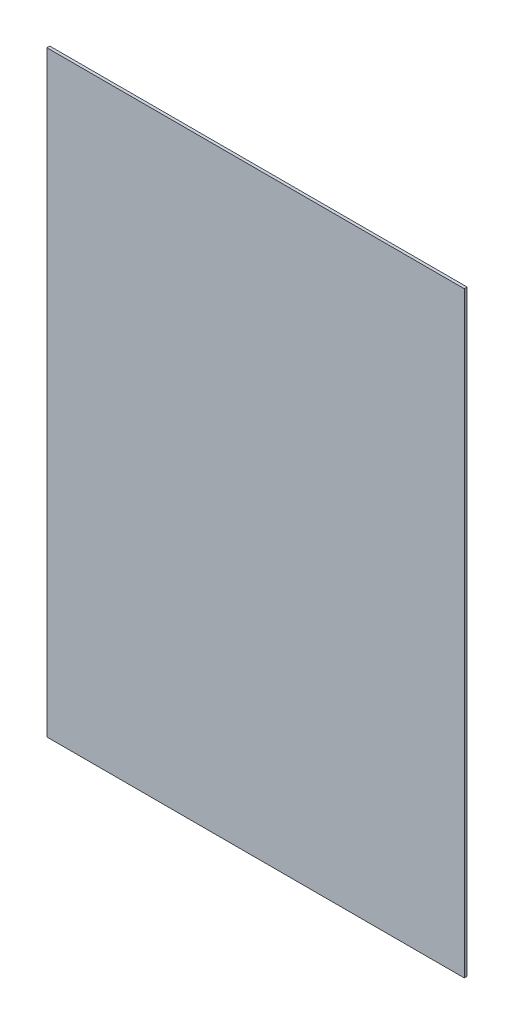
ISO-10303-21;
HEADER;
FILE_DESCRIPTION(('STEP AP214'),'2;1');
FILE_NAME('part.step','',(''),(''),'','','');
FILE_SCHEMA(('AUTOMOTIVE_DESIGN { 1 0 10303 214 1 1 1 1 }'));
ENDSEC;
DATA;
#1=APPLICATION_CONTEXT('core data for automotive mechanical design processes');
#2=APPLICATION_PROTOCOL_DEFINITION('international standard','automotive_design',2000,#1);
#3=PRODUCT_CONTEXT('',#1,'mechanical');
#4=PRODUCT('Part','Part','',(#3));
#5=PRODUCT_RELATED_PRODUCT_CATEGORY('part','',(#4));
#6=PRODUCT_DEFINITION_FORMATION('','',#4);
#7=PRODUCT_DEFINITION_CONTEXT('part definition',#1,'design');
#8=PRODUCT_DEFINITION('design','',#6,#7);
#9=PRODUCT_DEFINITION_SHAPE('','',#8);
#10=(LENGTH_UNIT() NAMED_UNIT(*) SI_UNIT(.MILLI.,.METRE.));
#11=(NAMED_UNIT(*) PLANE_ANGLE_UNIT() SI_UNIT($,.RADIAN.));
#12=(NAMED_UNIT(*) SI_UNIT($,.STERADIAN.) SOLID_ANGLE_UNIT());
#13=UNCERTAINTY_MEASURE_WITH_UNIT(LENGTH_MEASURE(1.E-05),#10,'distance_accuracy_value','');
#14=(GEOMETRIC_REPRESENTATION_CONTEXT(3) GLOBAL_UNCERTAINTY_ASSIGNED_CONTEXT((#13)) GLOBAL_UNIT_ASSIGNED_CONTEXT((#10,
#11,#12)) REPRESENTATION_CONTEXT('',''));
#15=CARTESIAN_POINT('',(0.,0.,0.));
#16=DIRECTION('',(0.,0.,1.));
#17=DIRECTION('',(1.,0.,0.));
#18=AXIS2_PLACEMENT_3D('',#15,#16,#17);
#19=CARTESIAN_POINT('',(144.05,205.95,2.));
#20=DIRECTION('',(-1.,0.,0.));
#21=DIRECTION('',(0.,-1.,0.));
#22=AXIS2_PLACEMENT_3D('',#19,#20,#21);
#23=PLANE('',#22);
#24=DIRECTION('',(0.,1.,0.));
#25=VECTOR('',#24,1.);
#26=CARTESIAN_POINT('',(144.05,205.95,0.));
#27=LINE('',#26,#25);
#28=CARTESIAN_POINT('',(144.05,-205.95,0.));
#29=VERTEX_POINT('',#28);
#30=CARTESIAN_POINT('',(144.05,205.95,0.));
#31=VERTEX_POINT('',#30);
#32=EDGE_CURVE('E96',#29,#31,#27,.T.);
#33=ORIENTED_EDGE('',*,*,#32,.T.);
#34=DIRECTION('',(0.,0.,-1.));
#35=VECTOR('',#34,1.);
#36=CARTESIAN_POINT('',(144.05,205.95,2.));
#37=LINE('',#36,#35);
#38=CARTESIAN_POINT('',(144.05,205.95,2.));
#39=VERTEX_POINT('',#38);
#40=EDGE_CURVE('E11',#39,#31,#37,.T.);
#41=ORIENTED_EDGE('',*,*,#40,.F.);
#42=DIRECTION('',(0.,1.,0.));
#43=VECTOR('',#42,1.);
#44=CARTESIAN_POINT('',(144.05,205.95,2.));
#45=LINE('',#44,#43);
#46=CARTESIAN_POINT('',(144.05,-205.95,2.));
#47=VERTEX_POINT('',#46);
#48=EDGE_CURVE('E84',#47,#39,#45,.T.);
#49=ORIENTED_EDGE('',*,*,#48,.F.);
#50=DIRECTION('',(0.,0.,-1.));
#51=VECTOR('',#50,1.);
#52=CARTESIAN_POINT('',(144.05,-205.95,2.));
#53=LINE('',#52,#51);
#54=EDGE_CURVE('E92',#47,#29,#53,.T.);
#55=ORIENTED_EDGE('',*,*,#54,.T.);
#56=EDGE_LOOP('',(#33,#41,#49,#55));
#57=FACE_BOUND('',#56,.T.);
#58=ADVANCED_FACE('F33',(#57),#23,.F.);
#59=CARTESIAN_POINT('',(-144.05,205.95,2.));
#60=DIRECTION('',(0.,-1.,0.));
#61=DIRECTION('',(0.,0.,-1.));
#62=AXIS2_PLACEMENT_3D('',#59,#60,#61);
#63=PLANE('',#62);
#64=DIRECTION('',(-1.,0.,0.));
#65=VECTOR('',#64,1.);
#66=CARTESIAN_POINT('',(-144.05,205.95,0.));
#67=LINE('',#66,#65);
#68=CARTESIAN_POINT('',(-144.05,205.95,0.));
#69=VERTEX_POINT('',#68);
#70=EDGE_CURVE('E88',#31,#69,#67,.T.);
#71=ORIENTED_EDGE('',*,*,#70,.T.);
#72=DIRECTION('',(0.,0.,-1.));
#73=VECTOR('',#72,1.);
#74=CARTESIAN_POINT('',(-144.05,205.95,2.));
#75=LINE('',#74,#73);
#76=CARTESIAN_POINT('',(-144.05,205.95,2.));
#77=VERTEX_POINT('',#76);
#78=EDGE_CURVE('E41',#77,#69,#75,.T.);
#79=ORIENTED_EDGE('',*,*,#78,.F.);
#80=DIRECTION('',(-1.,0.,0.));
#81=VECTOR('',#80,1.);
#82=CARTESIAN_POINT('',(-144.05,205.95,2.));
#83=LINE('',#82,#81);
#84=EDGE_CURVE('E79',#39,#77,#83,.T.);
#85=ORIENTED_EDGE('',*,*,#84,.F.);
#86=ORIENTED_EDGE('',*,*,#40,.T.);
#87=EDGE_LOOP('',(#71,#79,#85,#86));
#88=FACE_BOUND('',#87,.T.);
#89=ADVANCED_FACE('F87',(#88),#63,.F.);
#90=CARTESIAN_POINT('',(-144.05,205.95,2.));
#91=DIRECTION('',(1.,0.,0.));
#92=DIRECTION('',(0.,1.,0.));
#93=AXIS2_PLACEMENT_3D('',#90,#91,#92);
#94=PLANE('',#93);
#95=DIRECTION('',(0.,-1.,0.));
#96=VECTOR('',#95,1.);
#97=CARTESIAN_POINT('',(-144.05,205.95,0.));
#98=LINE('',#97,#96);
#99=CARTESIAN_POINT('',(-144.05,-205.95,0.));
#100=VERTEX_POINT('',#99);
#101=EDGE_CURVE('E66',#69,#100,#98,.T.);
#102=ORIENTED_EDGE('',*,*,#101,.T.);
#103=DIRECTION('',(0.,0.,-1.));
#104=VECTOR('',#103,1.);
#105=CARTESIAN_POINT('',(-144.05,-205.95,2.));
#106=LINE('',#105,#104);
#107=CARTESIAN_POINT('',(-144.05,-205.95,2.));
#108=VERTEX_POINT('',#107);
#109=EDGE_CURVE('E89',#108,#100,#106,.T.);
#110=ORIENTED_EDGE('',*,*,#109,.F.);
#111=DIRECTION('',(0.,-1.,0.));
#112=VECTOR('',#111,1.);
#113=CARTESIAN_POINT('',(-144.05,205.95,2.));
#114=LINE('',#113,#112);
#115=EDGE_CURVE('E82',#77,#108,#114,.T.);
#116=ORIENTED_EDGE('',*,*,#115,.F.);
#117=ORIENTED_EDGE('',*,*,#78,.T.);
#118=EDGE_LOOP('',(#102,#110,#116,#117));
#119=FACE_BOUND('',#118,.T.);
#120=ADVANCED_FACE('F90',(#119),#94,.F.);
#121=CARTESIAN_POINT('',(-144.05,-205.95,2.));
#122=DIRECTION('',(0.,1.,0.));
#123=DIRECTION('',(0.,0.,1.));
#124=AXIS2_PLACEMENT_3D('',#121,#122,#123);
#125=PLANE('',#124);
#126=DIRECTION('',(1.,0.,0.));
#127=VECTOR('',#126,1.);
#128=CARTESIAN_POINT('',(-144.05,-205.95,0.));
#129=LINE('',#128,#127);
#130=EDGE_CURVE('E72',#100,#29,#129,.T.);
#131=ORIENTED_EDGE('',*,*,#130,.T.);
#132=ORIENTED_EDGE('',*,*,#54,.F.);
#133=DIRECTION('',(1.,0.,0.));
#134=VECTOR('',#133,1.);
#135=CARTESIAN_POINT('',(-144.05,-205.95,2.));
#136=LINE('',#135,#134);
#137=EDGE_CURVE('E49',#108,#47,#136,.T.);
#138=ORIENTED_EDGE('',*,*,#137,.F.);
#139=ORIENTED_EDGE('',*,*,#109,.T.);
#140=EDGE_LOOP('',(#131,#132,#138,#139));
#141=FACE_BOUND('',#140,.T.);
#142=ADVANCED_FACE('F103',(#141),#125,.F.);
#143=CARTESIAN_POINT('',(0.,0.,2.));
#144=DIRECTION('',(0.,0.,1.));
#145=DIRECTION('',(1.,0.,0.));
#146=AXIS2_PLACEMENT_3D('',#143,#144,#145);
#147=PLANE('',#146);
#148=ORIENTED_EDGE('',*,*,#48,.T.);
#149=ORIENTED_EDGE('',*,*,#84,.T.);
#150=ORIENTED_EDGE('',*,*,#115,.T.);
#151=ORIENTED_EDGE('',*,*,#137,.T.);
#152=EDGE_LOOP('',(#148,#149,#150,#151));
#153=FACE_BOUND('',#152,.T.);
#154=ADVANCED_FACE('F80',(#153),#147,.T.);
#155=CARTESIAN_POINT('',(0.,0.,0.));
#156=DIRECTION('',(0.,0.,1.));
#157=DIRECTION('',(1.,0.,0.));
#158=AXIS2_PLACEMENT_3D('',#155,#156,#157);
#159=PLANE('',#158);
#160=ORIENTED_EDGE('',*,*,#32,.F.);
#161=ORIENTED_EDGE('',*,*,#130,.F.);
#162=ORIENTED_EDGE('',*,*,#101,.F.);
#163=ORIENTED_EDGE('',*,*,#70,.F.);
#164=EDGE_LOOP('',(#160,#161,#162,#163));
#165=FACE_BOUND('',#164,.T.);
#166=ADVANCED_FACE('F106',(#165),#159,.F.);
#167=CLOSED_SHELL('',(#58,#89,#120,#142,#154,#166));
#168=MANIFOLD_SOLID_BREP('B2',#167);
#169=ADVANCED_BREP_SHAPE_REPRESENTATION('',(#18,#168),#14);
#170=SHAPE_DEFINITION_REPRESENTATION(#9,#169);
ENDSEC;
END-ISO-10303-21;
